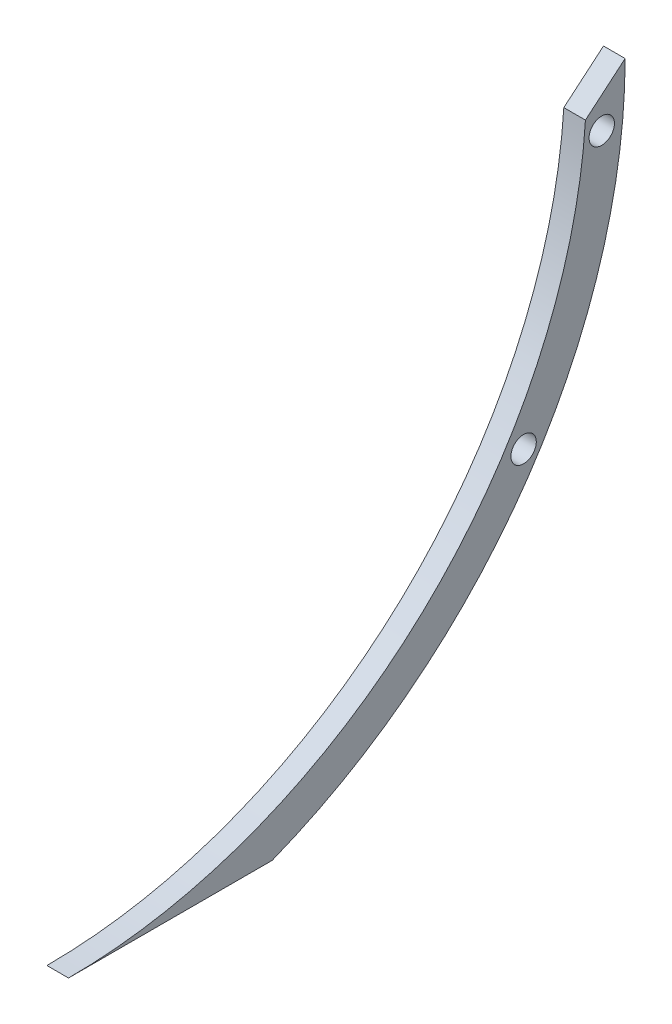
ISO-10303-21;
HEADER;
FILE_DESCRIPTION(('STEP AP214'),'2;1');
FILE_NAME('part.step','',(''),(''),'','','');
FILE_SCHEMA(('AUTOMOTIVE_DESIGN { 1 0 10303 214 1 1 1 1 }'));
ENDSEC;
DATA;
#1=APPLICATION_CONTEXT('core data for automotive mechanical design processes');
#2=APPLICATION_PROTOCOL_DEFINITION('international standard','automotive_design',2000,#1);
#3=PRODUCT_CONTEXT('',#1,'mechanical');
#4=PRODUCT('Part','Part','',(#3));
#5=PRODUCT_RELATED_PRODUCT_CATEGORY('part','',(#4));
#6=PRODUCT_DEFINITION_FORMATION('','',#4);
#7=PRODUCT_DEFINITION_CONTEXT('part definition',#1,'design');
#8=PRODUCT_DEFINITION('design','',#6,#7);
#9=PRODUCT_DEFINITION_SHAPE('','',#8);
#10=(LENGTH_UNIT() NAMED_UNIT(*) SI_UNIT(.MILLI.,.METRE.));
#11=(NAMED_UNIT(*) PLANE_ANGLE_UNIT() SI_UNIT($,.RADIAN.));
#12=(NAMED_UNIT(*) SI_UNIT($,.STERADIAN.) SOLID_ANGLE_UNIT());
#13=UNCERTAINTY_MEASURE_WITH_UNIT(LENGTH_MEASURE(1.E-05),#10,'distance_accuracy_value','');
#14=(GEOMETRIC_REPRESENTATION_CONTEXT(3) GLOBAL_UNCERTAINTY_ASSIGNED_CONTEXT((#13)) GLOBAL_UNIT_ASSIGNED_CONTEXT((#10,
#11,#12)) REPRESENTATION_CONTEXT('',''));
#15=CARTESIAN_POINT('',(0.,0.,0.));
#16=DIRECTION('',(0.,0.,1.));
#17=DIRECTION('',(1.,0.,0.));
#18=AXIS2_PLACEMENT_3D('',#15,#16,#17);
#19=CARTESIAN_POINT('',(5.4102,0.,0.));
#20=DIRECTION('',(-1.,0.,0.));
#21=DIRECTION('',(0.,0.,1.));
#22=AXIS2_PLACEMENT_3D('',#19,#20,#21);
#23=CYLINDRICAL_SURFACE('',#22,129.54);
#24=DIRECTION('',(1.,0.,0.));
#25=VECTOR('',#24,1.);
#26=CARTESIAN_POINT('',(0.,-8.37780245966645,-129.268805308732));
#27=LINE('',#26,#25);
#28=CARTESIAN_POINT('',(0.,-8.37780245966645,-129.268805308732));
#29=VERTEX_POINT('',#28);
#30=CARTESIAN_POINT('',(5.4102,-8.37780245966645,-129.268805308732));
#31=VERTEX_POINT('',#30);
#32=EDGE_CURVE('E85',#29,#31,#27,.T.);
#33=ORIENTED_EDGE('',*,*,#32,.F.);
#34=CARTESIAN_POINT('',(0.,0.,0.));
#35=DIRECTION('',(1.,0.,0.));
#36=DIRECTION('',(0.,0.,-1.));
#37=AXIS2_PLACEMENT_3D('',#34,#35,#36);
#38=CIRCLE('',#37,129.54);
#39=CARTESIAN_POINT('',(0.,-129.54,0.));
#40=VERTEX_POINT('',#39);
#41=EDGE_CURVE('E84',#40,#29,#38,.T.);
#42=ORIENTED_EDGE('',*,*,#41,.F.);
#43=DIRECTION('',(-1.,0.,0.));
#44=VECTOR('',#43,1.);
#45=CARTESIAN_POINT('',(5.4102,-129.54,0.));
#46=LINE('',#45,#44);
#47=CARTESIAN_POINT('',(5.4102,-129.54,0.));
#48=VERTEX_POINT('',#47);
#49=EDGE_CURVE('E11',#48,#40,#46,.T.);
#50=ORIENTED_EDGE('',*,*,#49,.F.);
#51=CARTESIAN_POINT('',(5.4102,0.,0.));
#52=DIRECTION('',(1.,0.,0.));
#53=DIRECTION('',(0.,0.,-1.));
#54=AXIS2_PLACEMENT_3D('',#51,#52,#53);
#55=CIRCLE('',#54,129.54);
#56=EDGE_CURVE('E107',#48,#31,#55,.T.);
#57=ORIENTED_EDGE('',*,*,#56,.T.);
#58=EDGE_LOOP('',(#33,#42,#50,#57));
#59=FACE_BOUND('',#58,.T.);
#60=ADVANCED_FACE('F34',(#59),#23,.F.);
#61=CARTESIAN_POINT('',(5.4102,-129.54,0.));
#62=DIRECTION('',(0.,1.,0.));
#63=DIRECTION('',(0.,0.,1.));
#64=AXIS2_PLACEMENT_3D('',#61,#62,#63);
#65=PLANE('',#64);
#66=DIRECTION('',(0.,0.,-1.));
#67=VECTOR('',#66,1.);
#68=CARTESIAN_POINT('',(0.,-129.54,0.));
#69=LINE('',#68,#67);
#70=CARTESIAN_POINT('',(0.,-129.54,-50.9293752563292));
#71=VERTEX_POINT('',#70);
#72=EDGE_CURVE('E91',#40,#71,#69,.T.);
#73=ORIENTED_EDGE('',*,*,#72,.T.);
#74=DIRECTION('',(-1.,0.,0.));
#75=VECTOR('',#74,1.);
#76=CARTESIAN_POINT('',(5.4102,-129.54,-50.9293752563292));
#77=LINE('',#76,#75);
#78=CARTESIAN_POINT('',(5.4102,-129.54,-50.9293752563292));
#79=VERTEX_POINT('',#78);
#80=EDGE_CURVE('E43',#79,#71,#77,.T.);
#81=ORIENTED_EDGE('',*,*,#80,.F.);
#82=DIRECTION('',(0.,0.,-1.));
#83=VECTOR('',#82,1.);
#84=CARTESIAN_POINT('',(5.4102,-129.54,0.));
#85=LINE('',#84,#83);
#86=EDGE_CURVE('E105',#48,#79,#85,.T.);
#87=ORIENTED_EDGE('',*,*,#86,.F.);
#88=ORIENTED_EDGE('',*,*,#49,.T.);
#89=EDGE_LOOP('',(#73,#81,#87,#88));
#90=FACE_BOUND('',#89,.T.);
#91=ADVANCED_FACE('F122',(#90),#65,.F.);
#92=CARTESIAN_POINT('',(5.4102,0.,0.));
#93=DIRECTION('',(-1.,0.,0.));
#94=DIRECTION('',(0.,0.,1.));
#95=AXIS2_PLACEMENT_3D('',#92,#93,#94);
#96=CYLINDRICAL_SURFACE('',#95,139.192);
#97=CARTESIAN_POINT('',(0.,0.,0.));
#98=DIRECTION('',(1.,0.,0.));
#99=DIRECTION('',(0.,0.,-1.));
#100=AXIS2_PLACEMENT_3D('',#97,#98,#99);
#101=CIRCLE('',#100,139.192);
#102=CARTESIAN_POINT('',(0.,0.,-139.192));
#103=VERTEX_POINT('',#102);
#104=EDGE_CURVE('E65',#71,#103,#101,.T.);
#105=ORIENTED_EDGE('',*,*,#104,.T.);
#106=DIRECTION('',(-1.,0.,0.));
#107=VECTOR('',#106,1.);
#108=CARTESIAN_POINT('',(5.4102,0.,-139.192));
#109=LINE('',#108,#107);
#110=CARTESIAN_POINT('',(5.4102,0.,-139.192));
#111=VERTEX_POINT('',#110);
#112=EDGE_CURVE('E70',#111,#103,#109,.T.);
#113=ORIENTED_EDGE('',*,*,#112,.F.);
#114=CARTESIAN_POINT('',(5.4102,0.,0.));
#115=DIRECTION('',(1.,0.,0.));
#116=DIRECTION('',(0.,0.,-1.));
#117=AXIS2_PLACEMENT_3D('',#114,#115,#116);
#118=CIRCLE('',#117,139.192);
#119=EDGE_CURVE('E51',#79,#111,#118,.T.);
#120=ORIENTED_EDGE('',*,*,#119,.F.);
#121=ORIENTED_EDGE('',*,*,#80,.T.);
#122=EDGE_LOOP('',(#105,#113,#120,#121));
#123=FACE_BOUND('',#122,.T.);
#124=ADVANCED_FACE('F87',(#123),#96,.T.);
#125=CARTESIAN_POINT('',(5.4102,-71.9099026378632,-113.804702462653));
#126=DIRECTION('',(-1.,0.,0.));
#127=DIRECTION('',(0.,0.,1.));
#128=AXIS2_PLACEMENT_3D('',#125,#126,#127);
#129=CYLINDRICAL_SURFACE('',#128,3.175);
#130=CARTESIAN_POINT('',(5.4102,-71.9099026378632,-113.804702462653));
#131=DIRECTION('',(1.,0.,0.));
#132=DIRECTION('',(0.,0.,-1.));
#133=AXIS2_PLACEMENT_3D('',#130,#131,#132);
#134=CIRCLE('',#133,3.175);
#135=CARTESIAN_POINT('',(5.4102,-71.9099026378632,-116.979702462653));
#136=VERTEX_POINT('',#135);
#137=EDGE_CURVE('E94',#136,#136,#134,.T.);
#138=ORIENTED_EDGE('',*,*,#137,.T.);
#139=EDGE_LOOP('',(#138));
#140=FACE_BOUND('',#139,.T.);
#141=CARTESIAN_POINT('',(0.,-71.9099026378632,-113.804702462653));
#142=DIRECTION('',(1.,0.,0.));
#143=DIRECTION('',(0.,0.,-1.));
#144=AXIS2_PLACEMENT_3D('',#141,#142,#143);
#145=CIRCLE('',#144,3.175);
#146=CARTESIAN_POINT('',(0.,-71.9099026378632,-116.979702462653));
#147=VERTEX_POINT('',#146);
#148=EDGE_CURVE('E99',#147,#147,#145,.T.);
#149=ORIENTED_EDGE('',*,*,#148,.F.);
#150=EDGE_LOOP('',(#149));
#151=FACE_BOUND('',#150,.T.);
#152=ADVANCED_FACE('F36',(#140,#151),#129,.F.);
#153=CARTESIAN_POINT('',(5.4102,-12.7,-133.35));
#154=DIRECTION('',(-1.,0.,0.));
#155=DIRECTION('',(0.,0.,1.));
#156=AXIS2_PLACEMENT_3D('',#153,#154,#155);
#157=CYLINDRICAL_SURFACE('',#156,3.175);
#158=CARTESIAN_POINT('',(5.4102,-12.7,-133.35));
#159=DIRECTION('',(1.,0.,0.));
#160=DIRECTION('',(0.,0.,-1.));
#161=AXIS2_PLACEMENT_3D('',#158,#159,#160);
#162=CIRCLE('',#161,3.175);
#163=CARTESIAN_POINT('',(5.4102,-12.7,-136.525));
#164=VERTEX_POINT('',#163);
#165=EDGE_CURVE('E78',#164,#164,#162,.T.);
#166=ORIENTED_EDGE('',*,*,#165,.T.);
#167=EDGE_LOOP('',(#166));
#168=FACE_BOUND('',#167,.T.);
#169=CARTESIAN_POINT('',(0.,-12.7,-133.35));
#170=DIRECTION('',(1.,0.,0.));
#171=DIRECTION('',(0.,0.,-1.));
#172=AXIS2_PLACEMENT_3D('',#169,#170,#171);
#173=CIRCLE('',#172,3.175);
#174=CARTESIAN_POINT('',(0.,-12.7,-136.525));
#175=VERTEX_POINT('',#174);
#176=EDGE_CURVE('E90',#175,#175,#173,.T.);
#177=ORIENTED_EDGE('',*,*,#176,.F.);
#178=EDGE_LOOP('',(#177));
#179=FACE_BOUND('',#178,.T.);
#180=ADVANCED_FACE('F131',(#168,#179),#157,.F.);
#181=CARTESIAN_POINT('',(5.4102,0.,0.));
#182=DIRECTION('',(1.,0.,0.));
#183=DIRECTION('',(0.,0.,-1.));
#184=AXIS2_PLACEMENT_3D('',#181,#182,#183);
#185=PLANE('',#184);
#186=DIRECTION('',(0.,0.645100618044248,-0.764097632897086));
#187=VECTOR('',#186,1.);
#188=CARTESIAN_POINT('',(5.4102,0.,-139.192));
#189=LINE('',#188,#187);
#190=EDGE_CURVE('E77',#31,#111,#189,.T.);
#191=ORIENTED_EDGE('',*,*,#190,.F.);
#192=ORIENTED_EDGE('',*,*,#56,.F.);
#193=ORIENTED_EDGE('',*,*,#86,.T.);
#194=ORIENTED_EDGE('',*,*,#119,.T.);
#195=EDGE_LOOP('',(#191,#192,#193,#194));
#196=FACE_BOUND('',#195,.T.);
#197=ORIENTED_EDGE('',*,*,#137,.F.);
#198=EDGE_LOOP('',(#197));
#199=FACE_BOUND('',#198,.T.);
#200=ORIENTED_EDGE('',*,*,#165,.F.);
#201=EDGE_LOOP('',(#200));
#202=FACE_BOUND('',#201,.T.);
#203=ADVANCED_FACE('F118',(#196,#199,#202),#185,.T.);
#204=CARTESIAN_POINT('',(0.,0.,0.));
#205=DIRECTION('',(1.,0.,0.));
#206=DIRECTION('',(0.,0.,-1.));
#207=AXIS2_PLACEMENT_3D('',#204,#205,#206);
#208=PLANE('',#207);
#209=ORIENTED_EDGE('',*,*,#148,.T.);
#210=EDGE_LOOP('',(#209));
#211=FACE_BOUND('',#210,.T.);
#212=ORIENTED_EDGE('',*,*,#41,.T.);
#213=DIRECTION('',(0.,0.645100618044248,-0.764097632897086));
#214=VECTOR('',#213,1.);
#215=CARTESIAN_POINT('',(0.,0.,-139.192));
#216=LINE('',#215,#214);
#217=EDGE_CURVE('E73',#29,#103,#216,.T.);
#218=ORIENTED_EDGE('',*,*,#217,.T.);
#219=ORIENTED_EDGE('',*,*,#104,.F.);
#220=ORIENTED_EDGE('',*,*,#72,.F.);
#221=EDGE_LOOP('',(#212,#218,#219,#220));
#222=FACE_BOUND('',#221,.T.);
#223=ORIENTED_EDGE('',*,*,#176,.T.);
#224=EDGE_LOOP('',(#223));
#225=FACE_BOUND('',#224,.T.);
#226=ADVANCED_FACE('F81',(#211,#222,#225),#208,.F.);
#227=CARTESIAN_POINT('',(0.,0.,-139.192));
#228=DIRECTION('',(0.,-0.764097632897086,-0.645100618044248));
#229=DIRECTION('',(0.,0.645100618044248,-0.764097632897086));
#230=AXIS2_PLACEMENT_3D('',#227,#228,#229);
#231=PLANE('',#230);
#232=ORIENTED_EDGE('',*,*,#190,.T.);
#233=ORIENTED_EDGE('',*,*,#112,.T.);
#234=ORIENTED_EDGE('',*,*,#217,.F.);
#235=ORIENTED_EDGE('',*,*,#32,.T.);
#236=EDGE_LOOP('',(#232,#233,#234,#235));
#237=FACE_BOUND('',#236,.T.);
#238=ADVANCED_FACE('F71',(#237),#231,.F.);
#239=CLOSED_SHELL('',(#60,#91,#124,#152,#180,#203,#226,#238));
#240=MANIFOLD_SOLID_BREP('B2',#239);
#241=ADVANCED_BREP_SHAPE_REPRESENTATION('',(#18,#240),#14);
#242=SHAPE_DEFINITION_REPRESENTATION(#9,#241);
ENDSEC;
END-ISO-10303-21;
